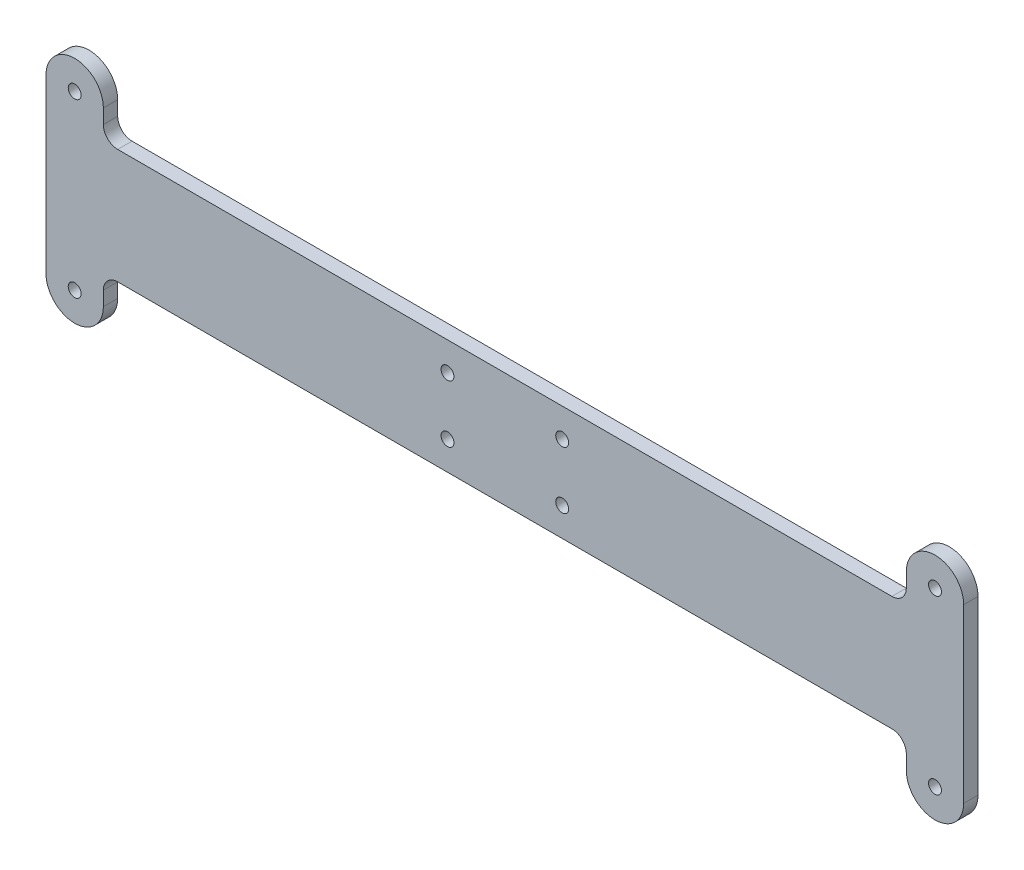
ISO-10303-21;
HEADER;
FILE_DESCRIPTION(('STEP AP214'),'2;1');
FILE_NAME('part.step','',(''),(''),'','','');
FILE_SCHEMA(('AUTOMOTIVE_DESIGN { 1 0 10303 214 1 1 1 1 }'));
ENDSEC;
DATA;
#1=APPLICATION_CONTEXT('core data for automotive mechanical design processes');
#2=APPLICATION_PROTOCOL_DEFINITION('international standard','automotive_design',2000,#1);
#3=PRODUCT_CONTEXT('',#1,'mechanical');
#4=PRODUCT('Part','Part','',(#3));
#5=PRODUCT_RELATED_PRODUCT_CATEGORY('part','',(#4));
#6=PRODUCT_DEFINITION_FORMATION('','',#4);
#7=PRODUCT_DEFINITION_CONTEXT('part definition',#1,'design');
#8=PRODUCT_DEFINITION('design','',#6,#7);
#9=PRODUCT_DEFINITION_SHAPE('','',#8);
#10=(LENGTH_UNIT() NAMED_UNIT(*) SI_UNIT(.MILLI.,.METRE.));
#11=(NAMED_UNIT(*) PLANE_ANGLE_UNIT() SI_UNIT($,.RADIAN.));
#12=(NAMED_UNIT(*) SI_UNIT($,.STERADIAN.) SOLID_ANGLE_UNIT());
#13=UNCERTAINTY_MEASURE_WITH_UNIT(LENGTH_MEASURE(1.E-05),#10,'distance_accuracy_value','');
#14=(GEOMETRIC_REPRESENTATION_CONTEXT(3) GLOBAL_UNCERTAINTY_ASSIGNED_CONTEXT((#13)) GLOBAL_UNIT_ASSIGNED_CONTEXT((#10,
#11,#12)) REPRESENTATION_CONTEXT('',''));
#15=CARTESIAN_POINT('',(0.,0.,0.));
#16=DIRECTION('',(0.,0.,1.));
#17=DIRECTION('',(1.,0.,0.));
#18=AXIS2_PLACEMENT_3D('',#15,#16,#17);
#19=CARTESIAN_POINT('',(150.,-10.,5.));
#20=DIRECTION('',(0.,0.,1.));
#21=DIRECTION('',(1.,0.,0.));
#22=AXIS2_PLACEMENT_3D('',#19,#20,#21);
#23=PLANE('',#22);
#24=CARTESIAN_POINT('',(-20.,10.,5.));
#25=DIRECTION('',(0.,0.,-1.));
#26=DIRECTION('',(-1.,0.,0.));
#27=AXIS2_PLACEMENT_3D('',#24,#25,#26);
#28=CIRCLE('',#27,2.25);
#29=CARTESIAN_POINT('',(-22.25,10.,5.));
#30=VERTEX_POINT('',#29);
#31=EDGE_CURVE('E351',#30,#30,#28,.T.);
#32=ORIENTED_EDGE('',*,*,#31,.T.);
#33=EDGE_LOOP('',(#32));
#34=FACE_BOUND('',#33,.T.);
#35=CARTESIAN_POINT('',(20.,10.,5.));
#36=DIRECTION('',(0.,0.,-1.));
#37=DIRECTION('',(-1.,0.,0.));
#38=AXIS2_PLACEMENT_3D('',#35,#36,#37);
#39=CIRCLE('',#38,2.25);
#40=CARTESIAN_POINT('',(17.75,10.,5.));
#41=VERTEX_POINT('',#40);
#42=EDGE_CURVE('E361',#41,#41,#39,.T.);
#43=ORIENTED_EDGE('',*,*,#42,.T.);
#44=EDGE_LOOP('',(#43));
#45=FACE_BOUND('',#44,.T.);
#46=CARTESIAN_POINT('',(20.,30.,5.));
#47=DIRECTION('',(0.,0.,-1.));
#48=DIRECTION('',(-1.,0.,0.));
#49=AXIS2_PLACEMENT_3D('',#46,#47,#48);
#50=CIRCLE('',#49,2.25);
#51=CARTESIAN_POINT('',(17.75,30.,5.));
#52=VERTEX_POINT('',#51);
#53=EDGE_CURVE('E367',#52,#52,#50,.T.);
#54=ORIENTED_EDGE('',*,*,#53,.T.);
#55=EDGE_LOOP('',(#54));
#56=FACE_BOUND('',#55,.T.);
#57=CARTESIAN_POINT('',(-20.,30.,5.));
#58=DIRECTION('',(0.,0.,-1.));
#59=DIRECTION('',(-1.,0.,0.));
#60=AXIS2_PLACEMENT_3D('',#57,#58,#59);
#61=CIRCLE('',#60,2.25);
#62=CARTESIAN_POINT('',(-22.25,30.,5.));
#63=VERTEX_POINT('',#62);
#64=EDGE_CURVE('E373',#63,#63,#61,.T.);
#65=ORIENTED_EDGE('',*,*,#64,.T.);
#66=EDGE_LOOP('',(#65));
#67=FACE_BOUND('',#66,.T.);
#68=CARTESIAN_POINT('',(-150.,-10.,5.));
#69=DIRECTION('',(0.,0.,-1.));
#70=DIRECTION('',(-1.,0.,0.));
#71=AXIS2_PLACEMENT_3D('',#68,#69,#70);
#72=CIRCLE('',#71,2.25);
#73=CARTESIAN_POINT('',(-152.25,-10.,5.));
#74=VERTEX_POINT('',#73);
#75=EDGE_CURVE('E391',#74,#74,#72,.T.);
#76=ORIENTED_EDGE('',*,*,#75,.T.);
#77=EDGE_LOOP('',(#76));
#78=FACE_BOUND('',#77,.T.);
#79=CARTESIAN_POINT('',(150.,-10.,5.));
#80=DIRECTION('',(0.,0.,1.));
#81=DIRECTION('',(1.,0.,0.));
#82=AXIS2_PLACEMENT_3D('',#79,#80,#81);
#83=CIRCLE('',#82,9.99999999999999);
#84=CARTESIAN_POINT('',(140.,-10.,5.));
#85=VERTEX_POINT('',#84);
#86=CARTESIAN_POINT('',(160.,-10.,5.));
#87=VERTEX_POINT('',#86);
#88=EDGE_CURVE('E209',#85,#87,#83,.T.);
#89=ORIENTED_EDGE('',*,*,#88,.T.);
#90=DIRECTION('',(0.,1.,0.));
#91=VECTOR('',#90,1.);
#92=CARTESIAN_POINT('',(160.,-10.,5.));
#93=LINE('',#92,#91);
#94=CARTESIAN_POINT('',(160.,50.,5.));
#95=VERTEX_POINT('',#94);
#96=EDGE_CURVE('E117',#87,#95,#93,.T.);
#97=ORIENTED_EDGE('',*,*,#96,.T.);
#98=CARTESIAN_POINT('',(150.,50.,5.));
#99=DIRECTION('',(0.,0.,1.));
#100=DIRECTION('',(-1.,0.,0.));
#101=AXIS2_PLACEMENT_3D('',#98,#99,#100);
#102=CIRCLE('',#101,9.99999999999998);
#103=CARTESIAN_POINT('',(140.,50.,5.));
#104=VERTEX_POINT('',#103);
#105=EDGE_CURVE('E248',#95,#104,#102,.T.);
#106=ORIENTED_EDGE('',*,*,#105,.T.);
#107=DIRECTION('',(0.,-1.,0.));
#108=VECTOR('',#107,1.);
#109=CARTESIAN_POINT('',(140.,45.,5.));
#110=LINE('',#109,#108);
#111=CARTESIAN_POINT('',(140.,45.,5.));
#112=VERTEX_POINT('',#111);
#113=EDGE_CURVE('E267',#104,#112,#110,.T.);
#114=ORIENTED_EDGE('',*,*,#113,.T.);
#115=CARTESIAN_POINT('',(135.,45.,5.));
#116=DIRECTION('',(0.,0.,-1.));
#117=DIRECTION('',(1.,0.,0.));
#118=AXIS2_PLACEMENT_3D('',#115,#116,#117);
#119=CIRCLE('',#118,5.);
#120=CARTESIAN_POINT('',(135.,40.,5.));
#121=VERTEX_POINT('',#120);
#122=EDGE_CURVE('E264',#112,#121,#119,.T.);
#123=ORIENTED_EDGE('',*,*,#122,.T.);
#124=DIRECTION('',(-1.,0.,0.));
#125=VECTOR('',#124,1.);
#126=CARTESIAN_POINT('',(-135.,40.,5.));
#127=LINE('',#126,#125);
#128=CARTESIAN_POINT('',(-135.,40.,5.));
#129=VERTEX_POINT('',#128);
#130=EDGE_CURVE('E266',#121,#129,#127,.T.);
#131=ORIENTED_EDGE('',*,*,#130,.T.);
#132=CARTESIAN_POINT('',(-135.,45.,5.));
#133=DIRECTION('',(0.,0.,-1.));
#134=DIRECTION('',(-1.,0.,0.));
#135=AXIS2_PLACEMENT_3D('',#132,#133,#134);
#136=CIRCLE('',#135,5.);
#137=CARTESIAN_POINT('',(-140.,45.,5.));
#138=VERTEX_POINT('',#137);
#139=EDGE_CURVE('E269',#129,#138,#136,.T.);
#140=ORIENTED_EDGE('',*,*,#139,.T.);
#141=DIRECTION('',(0.,1.,0.));
#142=VECTOR('',#141,1.);
#143=CARTESIAN_POINT('',(-140.,45.,5.));
#144=LINE('',#143,#142);
#145=CARTESIAN_POINT('',(-140.,50.,5.));
#146=VERTEX_POINT('',#145);
#147=EDGE_CURVE('E275',#138,#146,#144,.T.);
#148=ORIENTED_EDGE('',*,*,#147,.T.);
#149=CARTESIAN_POINT('',(-150.,50.,5.));
#150=DIRECTION('',(0.,0.,1.));
#151=DIRECTION('',(1.,0.,0.));
#152=AXIS2_PLACEMENT_3D('',#149,#150,#151);
#153=CIRCLE('',#152,9.99999999999999);
#154=CARTESIAN_POINT('',(-160.,50.,5.));
#155=VERTEX_POINT('',#154);
#156=EDGE_CURVE('E277',#146,#155,#153,.T.);
#157=ORIENTED_EDGE('',*,*,#156,.T.);
#158=DIRECTION('',(0.,-1.,0.));
#159=VECTOR('',#158,1.);
#160=CARTESIAN_POINT('',(-160.,-10.,5.));
#161=LINE('',#160,#159);
#162=CARTESIAN_POINT('',(-160.,-10.,5.));
#163=VERTEX_POINT('',#162);
#164=EDGE_CURVE('E279',#155,#163,#161,.T.);
#165=ORIENTED_EDGE('',*,*,#164,.T.);
#166=CARTESIAN_POINT('',(-150.,-10.,5.));
#167=DIRECTION('',(0.,0.,1.));
#168=DIRECTION('',(-1.,0.,0.));
#169=AXIS2_PLACEMENT_3D('',#166,#167,#168);
#170=CIRCLE('',#169,9.99999999999999);
#171=CARTESIAN_POINT('',(-140.,-10.,5.));
#172=VERTEX_POINT('',#171);
#173=EDGE_CURVE('E281',#163,#172,#170,.T.);
#174=ORIENTED_EDGE('',*,*,#173,.T.);
#175=DIRECTION('',(0.,1.,0.));
#176=VECTOR('',#175,1.);
#177=CARTESIAN_POINT('',(-140.,-5.00000000000004,5.));
#178=LINE('',#177,#176);
#179=CARTESIAN_POINT('',(-140.,-5.00000000000003,5.));
#180=VERTEX_POINT('',#179);
#181=EDGE_CURVE('E283',#172,#180,#178,.T.);
#182=ORIENTED_EDGE('',*,*,#181,.T.);
#183=CARTESIAN_POINT('',(-135.,-5.,5.));
#184=DIRECTION('',(0.,0.,-1.));
#185=DIRECTION('',(1.,0.,0.));
#186=AXIS2_PLACEMENT_3D('',#183,#184,#185);
#187=CIRCLE('',#186,5.);
#188=CARTESIAN_POINT('',(-135.,0.,5.));
#189=VERTEX_POINT('',#188);
#190=EDGE_CURVE('E160',#180,#189,#187,.T.);
#191=ORIENTED_EDGE('',*,*,#190,.T.);
#192=DIRECTION('',(1.,0.,0.));
#193=VECTOR('',#192,1.);
#194=CARTESIAN_POINT('',(-135.,0.,5.));
#195=LINE('',#194,#193);
#196=CARTESIAN_POINT('',(135.,0.,5.));
#197=VERTEX_POINT('',#196);
#198=EDGE_CURVE('E154',#189,#197,#195,.T.);
#199=ORIENTED_EDGE('',*,*,#198,.T.);
#200=CARTESIAN_POINT('',(135.,-5.,5.));
#201=DIRECTION('',(0.,0.,-1.));
#202=DIRECTION('',(-1.,0.,0.));
#203=AXIS2_PLACEMENT_3D('',#200,#201,#202);
#204=CIRCLE('',#203,5.);
#205=CARTESIAN_POINT('',(140.,-5.00000000000004,5.));
#206=VERTEX_POINT('',#205);
#207=EDGE_CURVE('E158',#197,#206,#204,.T.);
#208=ORIENTED_EDGE('',*,*,#207,.T.);
#209=DIRECTION('',(0.,-1.,0.));
#210=VECTOR('',#209,1.);
#211=CARTESIAN_POINT('',(140.,-5.00000000000004,5.));
#212=LINE('',#211,#210);
#213=EDGE_CURVE('E50',#206,#85,#212,.T.);
#214=ORIENTED_EDGE('',*,*,#213,.T.);
#215=EDGE_LOOP('',(#89,#97,#106,#114,#123,#131,#140,#148,#157,#165,#174,#182,#191,#199,#208,#214));
#216=FACE_BOUND('',#215,.T.);
#217=CARTESIAN_POINT('',(150.,50.,5.));
#218=DIRECTION('',(0.,0.,-1.));
#219=DIRECTION('',(-1.,0.,0.));
#220=AXIS2_PLACEMENT_3D('',#217,#218,#219);
#221=CIRCLE('',#220,2.25);
#222=CARTESIAN_POINT('',(147.75,50.,5.));
#223=VERTEX_POINT('',#222);
#224=EDGE_CURVE('E182',#223,#223,#221,.T.);
#225=ORIENTED_EDGE('',*,*,#224,.T.);
#226=EDGE_LOOP('',(#225));
#227=FACE_BOUND('',#226,.T.);
#228=CARTESIAN_POINT('',(-150.,50.,5.));
#229=DIRECTION('',(0.,0.,-1.));
#230=DIRECTION('',(-1.,0.,0.));
#231=AXIS2_PLACEMENT_3D('',#228,#229,#230);
#232=CIRCLE('',#231,2.25);
#233=CARTESIAN_POINT('',(-152.25,50.,5.));
#234=VERTEX_POINT('',#233);
#235=EDGE_CURVE('E385',#234,#234,#232,.T.);
#236=ORIENTED_EDGE('',*,*,#235,.T.);
#237=EDGE_LOOP('',(#236));
#238=FACE_BOUND('',#237,.T.);
#239=CARTESIAN_POINT('',(150.,-10.,5.));
#240=DIRECTION('',(0.,0.,-1.));
#241=DIRECTION('',(-1.,0.,0.));
#242=AXIS2_PLACEMENT_3D('',#239,#240,#241);
#243=CIRCLE('',#242,2.25);
#244=CARTESIAN_POINT('',(147.75,-10.,5.));
#245=VERTEX_POINT('',#244);
#246=EDGE_CURVE('E379',#245,#245,#243,.T.);
#247=ORIENTED_EDGE('',*,*,#246,.T.);
#248=EDGE_LOOP('',(#247));
#249=FACE_BOUND('',#248,.T.);
#250=ADVANCED_FACE('F33',(#34,#45,#56,#67,#78,#216,#227,#238,#249),#23,.T.);
#251=CARTESIAN_POINT('',(150.,-10.,0.));
#252=DIRECTION('',(0.,0.,1.));
#253=DIRECTION('',(1.,0.,0.));
#254=AXIS2_PLACEMENT_3D('',#251,#252,#253);
#255=PLANE('',#254);
#256=CARTESIAN_POINT('',(-20.,10.,0.));
#257=DIRECTION('',(0.,0.,-1.));
#258=DIRECTION('',(-1.,0.,0.));
#259=AXIS2_PLACEMENT_3D('',#256,#257,#258);
#260=CIRCLE('',#259,2.24999999999999);
#261=CARTESIAN_POINT('',(-22.25,10.,0.));
#262=VERTEX_POINT('',#261);
#263=EDGE_CURVE('E354',#262,#262,#260,.T.);
#264=ORIENTED_EDGE('',*,*,#263,.F.);
#265=EDGE_LOOP('',(#264));
#266=FACE_BOUND('',#265,.T.);
#267=CARTESIAN_POINT('',(20.,10.,0.));
#268=DIRECTION('',(0.,0.,-1.));
#269=DIRECTION('',(-1.,0.,0.));
#270=AXIS2_PLACEMENT_3D('',#267,#268,#269);
#271=CIRCLE('',#270,2.24999999999999);
#272=CARTESIAN_POINT('',(17.75,10.,0.));
#273=VERTEX_POINT('',#272);
#274=EDGE_CURVE('E356',#273,#273,#271,.T.);
#275=ORIENTED_EDGE('',*,*,#274,.F.);
#276=EDGE_LOOP('',(#275));
#277=FACE_BOUND('',#276,.T.);
#278=CARTESIAN_POINT('',(20.,30.,0.));
#279=DIRECTION('',(0.,0.,-1.));
#280=DIRECTION('',(-1.,0.,0.));
#281=AXIS2_PLACEMENT_3D('',#278,#279,#280);
#282=CIRCLE('',#281,2.24999999999999);
#283=CARTESIAN_POINT('',(17.75,30.,0.));
#284=VERTEX_POINT('',#283);
#285=EDGE_CURVE('E364',#284,#284,#282,.T.);
#286=ORIENTED_EDGE('',*,*,#285,.F.);
#287=EDGE_LOOP('',(#286));
#288=FACE_BOUND('',#287,.T.);
#289=CARTESIAN_POINT('',(-20.,30.,0.));
#290=DIRECTION('',(0.,0.,-1.));
#291=DIRECTION('',(-1.,0.,0.));
#292=AXIS2_PLACEMENT_3D('',#289,#290,#291);
#293=CIRCLE('',#292,2.24999999999999);
#294=CARTESIAN_POINT('',(-22.25,30.,0.));
#295=VERTEX_POINT('',#294);
#296=EDGE_CURVE('E370',#295,#295,#293,.T.);
#297=ORIENTED_EDGE('',*,*,#296,.F.);
#298=EDGE_LOOP('',(#297));
#299=FACE_BOUND('',#298,.T.);
#300=CARTESIAN_POINT('',(150.,-10.,0.));
#301=DIRECTION('',(0.,0.,-1.));
#302=DIRECTION('',(-1.,0.,0.));
#303=AXIS2_PLACEMENT_3D('',#300,#301,#302);
#304=CIRCLE('',#303,2.24999999999997);
#305=CARTESIAN_POINT('',(147.75,-10.,0.));
#306=VERTEX_POINT('',#305);
#307=EDGE_CURVE('E376',#306,#306,#304,.T.);
#308=ORIENTED_EDGE('',*,*,#307,.F.);
#309=EDGE_LOOP('',(#308));
#310=FACE_BOUND('',#309,.T.);
#311=CARTESIAN_POINT('',(-150.,50.,0.));
#312=DIRECTION('',(0.,0.,-1.));
#313=DIRECTION('',(-1.,0.,0.));
#314=AXIS2_PLACEMENT_3D('',#311,#312,#313);
#315=CIRCLE('',#314,2.24999999999997);
#316=CARTESIAN_POINT('',(-152.25,50.,0.));
#317=VERTEX_POINT('',#316);
#318=EDGE_CURVE('E382',#317,#317,#315,.T.);
#319=ORIENTED_EDGE('',*,*,#318,.F.);
#320=EDGE_LOOP('',(#319));
#321=FACE_BOUND('',#320,.T.);
#322=CARTESIAN_POINT('',(150.,50.,0.));
#323=DIRECTION('',(0.,0.,-1.));
#324=DIRECTION('',(-1.,0.,0.));
#325=AXIS2_PLACEMENT_3D('',#322,#323,#324);
#326=CIRCLE('',#325,2.24999999999997);
#327=CARTESIAN_POINT('',(147.75,50.,0.));
#328=VERTEX_POINT('',#327);
#329=EDGE_CURVE('E394',#328,#328,#326,.T.);
#330=ORIENTED_EDGE('',*,*,#329,.F.);
#331=EDGE_LOOP('',(#330));
#332=FACE_BOUND('',#331,.T.);
#333=CARTESIAN_POINT('',(150.,-10.,0.));
#334=DIRECTION('',(0.,0.,1.));
#335=DIRECTION('',(1.,0.,0.));
#336=AXIS2_PLACEMENT_3D('',#333,#334,#335);
#337=CIRCLE('',#336,9.99999999999999);
#338=CARTESIAN_POINT('',(140.,-10.,0.));
#339=VERTEX_POINT('',#338);
#340=CARTESIAN_POINT('',(160.,-10.,0.));
#341=VERTEX_POINT('',#340);
#342=EDGE_CURVE('E178',#339,#341,#337,.T.);
#343=ORIENTED_EDGE('',*,*,#342,.F.);
#344=DIRECTION('',(0.,-1.,0.));
#345=VECTOR('',#344,1.);
#346=CARTESIAN_POINT('',(140.,-5.00000000000004,0.));
#347=LINE('',#346,#345);
#348=CARTESIAN_POINT('',(140.,-5.00000000000004,0.));
#349=VERTEX_POINT('',#348);
#350=EDGE_CURVE('E109',#349,#339,#347,.T.);
#351=ORIENTED_EDGE('',*,*,#350,.F.);
#352=CARTESIAN_POINT('',(135.,-5.,0.));
#353=DIRECTION('',(0.,0.,-1.));
#354=DIRECTION('',(-1.,0.,0.));
#355=AXIS2_PLACEMENT_3D('',#352,#353,#354);
#356=CIRCLE('',#355,5.);
#357=CARTESIAN_POINT('',(135.,0.,0.));
#358=VERTEX_POINT('',#357);
#359=EDGE_CURVE('E103',#358,#349,#356,.T.);
#360=ORIENTED_EDGE('',*,*,#359,.F.);
#361=DIRECTION('',(1.,0.,0.));
#362=VECTOR('',#361,1.);
#363=CARTESIAN_POINT('',(-135.,0.,0.));
#364=LINE('',#363,#362);
#365=CARTESIAN_POINT('',(-135.,0.,0.));
#366=VERTEX_POINT('',#365);
#367=EDGE_CURVE('E168',#366,#358,#364,.T.);
#368=ORIENTED_EDGE('',*,*,#367,.F.);
#369=CARTESIAN_POINT('',(-135.,-5.,0.));
#370=DIRECTION('',(0.,0.,-1.));
#371=DIRECTION('',(1.,0.,0.));
#372=AXIS2_PLACEMENT_3D('',#369,#370,#371);
#373=CIRCLE('',#372,5.);
#374=CARTESIAN_POINT('',(-140.,-5.00000000000003,0.));
#375=VERTEX_POINT('',#374);
#376=EDGE_CURVE('E204',#375,#366,#373,.T.);
#377=ORIENTED_EDGE('',*,*,#376,.F.);
#378=DIRECTION('',(0.,1.,0.));
#379=VECTOR('',#378,1.);
#380=CARTESIAN_POINT('',(-140.,-5.00000000000004,0.));
#381=LINE('',#380,#379);
#382=CARTESIAN_POINT('',(-140.,-10.,0.));
#383=VERTEX_POINT('',#382);
#384=EDGE_CURVE('E202',#383,#375,#381,.T.);
#385=ORIENTED_EDGE('',*,*,#384,.F.);
#386=CARTESIAN_POINT('',(-150.,-10.,0.));
#387=DIRECTION('',(0.,0.,1.));
#388=DIRECTION('',(-1.,0.,0.));
#389=AXIS2_PLACEMENT_3D('',#386,#387,#388);
#390=CIRCLE('',#389,9.99999999999999);
#391=CARTESIAN_POINT('',(-160.,-10.,0.));
#392=VERTEX_POINT('',#391);
#393=EDGE_CURVE('E200',#392,#383,#390,.T.);
#394=ORIENTED_EDGE('',*,*,#393,.F.);
#395=DIRECTION('',(0.,-1.,0.));
#396=VECTOR('',#395,1.);
#397=CARTESIAN_POINT('',(-160.,-10.,0.));
#398=LINE('',#397,#396);
#399=CARTESIAN_POINT('',(-160.,50.,0.));
#400=VERTEX_POINT('',#399);
#401=EDGE_CURVE('E198',#400,#392,#398,.T.);
#402=ORIENTED_EDGE('',*,*,#401,.F.);
#403=CARTESIAN_POINT('',(-150.,50.,0.));
#404=DIRECTION('',(0.,0.,1.));
#405=DIRECTION('',(1.,0.,0.));
#406=AXIS2_PLACEMENT_3D('',#403,#404,#405);
#407=CIRCLE('',#406,9.99999999999999);
#408=CARTESIAN_POINT('',(-140.,50.,0.));
#409=VERTEX_POINT('',#408);
#410=EDGE_CURVE('E196',#409,#400,#407,.T.);
#411=ORIENTED_EDGE('',*,*,#410,.F.);
#412=DIRECTION('',(0.,1.,0.));
#413=VECTOR('',#412,1.);
#414=CARTESIAN_POINT('',(-140.,45.,0.));
#415=LINE('',#414,#413);
#416=CARTESIAN_POINT('',(-140.,45.,0.));
#417=VERTEX_POINT('',#416);
#418=EDGE_CURVE('E194',#417,#409,#415,.T.);
#419=ORIENTED_EDGE('',*,*,#418,.F.);
#420=CARTESIAN_POINT('',(-135.,45.,0.));
#421=DIRECTION('',(0.,0.,-1.));
#422=DIRECTION('',(-1.,0.,0.));
#423=AXIS2_PLACEMENT_3D('',#420,#421,#422);
#424=CIRCLE('',#423,5.);
#425=CARTESIAN_POINT('',(-135.,40.,0.));
#426=VERTEX_POINT('',#425);
#427=EDGE_CURVE('E192',#426,#417,#424,.T.);
#428=ORIENTED_EDGE('',*,*,#427,.F.);
#429=DIRECTION('',(-1.,0.,0.));
#430=VECTOR('',#429,1.);
#431=CARTESIAN_POINT('',(-135.,40.,0.));
#432=LINE('',#431,#430);
#433=CARTESIAN_POINT('',(135.,40.,0.));
#434=VERTEX_POINT('',#433);
#435=EDGE_CURVE('E190',#434,#426,#432,.T.);
#436=ORIENTED_EDGE('',*,*,#435,.F.);
#437=CARTESIAN_POINT('',(135.,45.,0.));
#438=DIRECTION('',(0.,0.,-1.));
#439=DIRECTION('',(1.,0.,0.));
#440=AXIS2_PLACEMENT_3D('',#437,#438,#439);
#441=CIRCLE('',#440,5.);
#442=CARTESIAN_POINT('',(140.,45.,0.));
#443=VERTEX_POINT('',#442);
#444=EDGE_CURVE('E188',#443,#434,#441,.T.);
#445=ORIENTED_EDGE('',*,*,#444,.F.);
#446=DIRECTION('',(0.,-1.,0.));
#447=VECTOR('',#446,1.);
#448=CARTESIAN_POINT('',(140.,45.,0.));
#449=LINE('',#448,#447);
#450=CARTESIAN_POINT('',(140.,50.,0.));
#451=VERTEX_POINT('',#450);
#452=EDGE_CURVE('E186',#451,#443,#449,.T.);
#453=ORIENTED_EDGE('',*,*,#452,.F.);
#454=CARTESIAN_POINT('',(150.,50.,0.));
#455=DIRECTION('',(0.,0.,1.));
#456=DIRECTION('',(-1.,0.,0.));
#457=AXIS2_PLACEMENT_3D('',#454,#455,#456);
#458=CIRCLE('',#457,9.99999999999998);
#459=CARTESIAN_POINT('',(160.,50.,0.));
#460=VERTEX_POINT('',#459);
#461=EDGE_CURVE('E184',#460,#451,#458,.T.);
#462=ORIENTED_EDGE('',*,*,#461,.F.);
#463=DIRECTION('',(0.,1.,0.));
#464=VECTOR('',#463,1.);
#465=CARTESIAN_POINT('',(160.,-10.,0.));
#466=LINE('',#465,#464);
#467=EDGE_CURVE('E181',#341,#460,#466,.T.);
#468=ORIENTED_EDGE('',*,*,#467,.F.);
#469=EDGE_LOOP('',(#343,#351,#360,#368,#377,#385,#394,#402,#411,#419,#428,#436,#445,#453,#462,#468));
#470=FACE_BOUND('',#469,.T.);
#471=CARTESIAN_POINT('',(-150.,-10.,0.));
#472=DIRECTION('',(0.,0.,-1.));
#473=DIRECTION('',(-1.,0.,0.));
#474=AXIS2_PLACEMENT_3D('',#471,#472,#473);
#475=CIRCLE('',#474,2.24999999999997);
#476=CARTESIAN_POINT('',(-152.25,-10.,0.));
#477=VERTEX_POINT('',#476);
#478=EDGE_CURVE('E388',#477,#477,#475,.T.);
#479=ORIENTED_EDGE('',*,*,#478,.F.);
#480=EDGE_LOOP('',(#479));
#481=FACE_BOUND('',#480,.T.);
#482=ADVANCED_FACE('F252',(#266,#277,#288,#299,#310,#321,#332,#470,#481),#255,.F.);
#483=CARTESIAN_POINT('',(150.,-10.,5.));
#484=DIRECTION('',(0.,0.,-1.));
#485=DIRECTION('',(-1.,0.,0.));
#486=AXIS2_PLACEMENT_3D('',#483,#484,#485);
#487=CYLINDRICAL_SURFACE('',#486,9.99999999999999);
#488=ORIENTED_EDGE('',*,*,#342,.T.);
#489=DIRECTION('',(0.,0.,-1.));
#490=VECTOR('',#489,1.);
#491=CARTESIAN_POINT('',(160.,-10.,5.));
#492=LINE('',#491,#490);
#493=EDGE_CURVE('E11',#87,#341,#492,.T.);
#494=ORIENTED_EDGE('',*,*,#493,.F.);
#495=ORIENTED_EDGE('',*,*,#88,.F.);
#496=DIRECTION('',(0.,0.,-1.));
#497=VECTOR('',#496,1.);
#498=CARTESIAN_POINT('',(140.,-10.,5.));
#499=LINE('',#498,#497);
#500=EDGE_CURVE('E174',#85,#339,#499,.T.);
#501=ORIENTED_EDGE('',*,*,#500,.T.);
#502=EDGE_LOOP('',(#488,#494,#495,#501));
#503=FACE_BOUND('',#502,.T.);
#504=ADVANCED_FACE('F35',(#503),#487,.T.);
#505=CARTESIAN_POINT('',(160.,-10.,5.));
#506=DIRECTION('',(-1.,0.,0.));
#507=DIRECTION('',(0.,0.,1.));
#508=AXIS2_PLACEMENT_3D('',#505,#506,#507);
#509=PLANE('',#508);
#510=ORIENTED_EDGE('',*,*,#467,.T.);
#511=DIRECTION('',(0.,0.,-1.));
#512=VECTOR('',#511,1.);
#513=CARTESIAN_POINT('',(160.,50.,5.));
#514=LINE('',#513,#512);
#515=EDGE_CURVE('E42',#95,#460,#514,.T.);
#516=ORIENTED_EDGE('',*,*,#515,.F.);
#517=ORIENTED_EDGE('',*,*,#96,.F.);
#518=ORIENTED_EDGE('',*,*,#493,.T.);
#519=EDGE_LOOP('',(#510,#516,#517,#518));
#520=FACE_BOUND('',#519,.T.);
#521=ADVANCED_FACE('F580',(#520),#509,.F.);
#522=CARTESIAN_POINT('',(150.,50.,5.));
#523=DIRECTION('',(0.,0.,-1.));
#524=DIRECTION('',(-1.,0.,0.));
#525=AXIS2_PLACEMENT_3D('',#522,#523,#524);
#526=CYLINDRICAL_SURFACE('',#525,9.99999999999998);
#527=ORIENTED_EDGE('',*,*,#461,.T.);
#528=DIRECTION('',(0.,0.,-1.));
#529=VECTOR('',#528,1.);
#530=CARTESIAN_POINT('',(140.,50.,5.));
#531=LINE('',#530,#529);
#532=EDGE_CURVE('E240',#104,#451,#531,.T.);
#533=ORIENTED_EDGE('',*,*,#532,.F.);
#534=ORIENTED_EDGE('',*,*,#105,.F.);
#535=ORIENTED_EDGE('',*,*,#515,.T.);
#536=EDGE_LOOP('',(#527,#533,#534,#535));
#537=FACE_BOUND('',#536,.T.);
#538=ADVANCED_FACE('F246',(#537),#526,.T.);
#539=CARTESIAN_POINT('',(140.,45.,5.));
#540=DIRECTION('',(1.,0.,0.));
#541=DIRECTION('',(0.,0.,-1.));
#542=AXIS2_PLACEMENT_3D('',#539,#540,#541);
#543=PLANE('',#542);
#544=ORIENTED_EDGE('',*,*,#452,.T.);
#545=DIRECTION('',(0.,0.,-1.));
#546=VECTOR('',#545,1.);
#547=CARTESIAN_POINT('',(140.,45.,5.));
#548=LINE('',#547,#546);
#549=EDGE_CURVE('E237',#112,#443,#548,.T.);
#550=ORIENTED_EDGE('',*,*,#549,.F.);
#551=ORIENTED_EDGE('',*,*,#113,.F.);
#552=ORIENTED_EDGE('',*,*,#532,.T.);
#553=EDGE_LOOP('',(#544,#550,#551,#552));
#554=FACE_BOUND('',#553,.T.);
#555=ADVANCED_FACE('F258',(#554),#543,.F.);
#556=CARTESIAN_POINT('',(135.,45.,5.));
#557=DIRECTION('',(0.,0.,-1.));
#558=DIRECTION('',(-1.,0.,0.));
#559=AXIS2_PLACEMENT_3D('',#556,#557,#558);
#560=CYLINDRICAL_SURFACE('',#559,5.);
#561=ORIENTED_EDGE('',*,*,#444,.T.);
#562=DIRECTION('',(0.,0.,-1.));
#563=VECTOR('',#562,1.);
#564=CARTESIAN_POINT('',(135.,40.,5.));
#565=LINE('',#564,#563);
#566=EDGE_CURVE('E234',#121,#434,#565,.T.);
#567=ORIENTED_EDGE('',*,*,#566,.F.);
#568=ORIENTED_EDGE('',*,*,#122,.F.);
#569=ORIENTED_EDGE('',*,*,#549,.T.);
#570=EDGE_LOOP('',(#561,#567,#568,#569));
#571=FACE_BOUND('',#570,.T.);
#572=ADVANCED_FACE('F262',(#571),#560,.F.);
#573=CARTESIAN_POINT('',(-135.,40.,5.));
#574=DIRECTION('',(0.,-1.,0.));
#575=DIRECTION('',(1.,0.,0.));
#576=AXIS2_PLACEMENT_3D('',#573,#574,#575);
#577=PLANE('',#576);
#578=ORIENTED_EDGE('',*,*,#435,.T.);
#579=DIRECTION('',(0.,0.,-1.));
#580=VECTOR('',#579,1.);
#581=CARTESIAN_POINT('',(-135.,40.,5.));
#582=LINE('',#581,#580);
#583=EDGE_CURVE('E231',#129,#426,#582,.T.);
#584=ORIENTED_EDGE('',*,*,#583,.F.);
#585=ORIENTED_EDGE('',*,*,#130,.F.);
#586=ORIENTED_EDGE('',*,*,#566,.T.);
#587=EDGE_LOOP('',(#578,#584,#585,#586));
#588=FACE_BOUND('',#587,.T.);
#589=ADVANCED_FACE('F545',(#588),#577,.F.);
#590=CARTESIAN_POINT('',(-135.,45.,5.));
#591=DIRECTION('',(0.,0.,-1.));
#592=DIRECTION('',(-1.,0.,0.));
#593=AXIS2_PLACEMENT_3D('',#590,#591,#592);
#594=CYLINDRICAL_SURFACE('',#593,5.);
#595=ORIENTED_EDGE('',*,*,#427,.T.);
#596=DIRECTION('',(0.,0.,-1.));
#597=VECTOR('',#596,1.);
#598=CARTESIAN_POINT('',(-140.,45.,5.));
#599=LINE('',#598,#597);
#600=EDGE_CURVE('E228',#138,#417,#599,.T.);
#601=ORIENTED_EDGE('',*,*,#600,.F.);
#602=ORIENTED_EDGE('',*,*,#139,.F.);
#603=ORIENTED_EDGE('',*,*,#583,.T.);
#604=EDGE_LOOP('',(#595,#601,#602,#603));
#605=FACE_BOUND('',#604,.T.);
#606=ADVANCED_FACE('F535',(#605),#594,.F.);
#607=CARTESIAN_POINT('',(-140.,45.,5.));
#608=DIRECTION('',(-1.,0.,0.));
#609=DIRECTION('',(0.,0.,1.));
#610=AXIS2_PLACEMENT_3D('',#607,#608,#609);
#611=PLANE('',#610);
#612=ORIENTED_EDGE('',*,*,#418,.T.);
#613=DIRECTION('',(0.,0.,-1.));
#614=VECTOR('',#613,1.);
#615=CARTESIAN_POINT('',(-140.,50.,5.));
#616=LINE('',#615,#614);
#617=EDGE_CURVE('E225',#146,#409,#616,.T.);
#618=ORIENTED_EDGE('',*,*,#617,.F.);
#619=ORIENTED_EDGE('',*,*,#147,.F.);
#620=ORIENTED_EDGE('',*,*,#600,.T.);
#621=EDGE_LOOP('',(#612,#618,#619,#620));
#622=FACE_BOUND('',#621,.T.);
#623=ADVANCED_FACE('F525',(#622),#611,.F.);
#624=CARTESIAN_POINT('',(-150.,50.,5.));
#625=DIRECTION('',(0.,0.,-1.));
#626=DIRECTION('',(-1.,0.,0.));
#627=AXIS2_PLACEMENT_3D('',#624,#625,#626);
#628=CYLINDRICAL_SURFACE('',#627,9.99999999999999);
#629=ORIENTED_EDGE('',*,*,#410,.T.);
#630=DIRECTION('',(0.,0.,-1.));
#631=VECTOR('',#630,1.);
#632=CARTESIAN_POINT('',(-160.,50.,5.));
#633=LINE('',#632,#631);
#634=EDGE_CURVE('E222',#155,#400,#633,.T.);
#635=ORIENTED_EDGE('',*,*,#634,.F.);
#636=ORIENTED_EDGE('',*,*,#156,.F.);
#637=ORIENTED_EDGE('',*,*,#617,.T.);
#638=EDGE_LOOP('',(#629,#635,#636,#637));
#639=FACE_BOUND('',#638,.T.);
#640=ADVANCED_FACE('F515',(#639),#628,.T.);
#641=CARTESIAN_POINT('',(-160.,-10.,5.));
#642=DIRECTION('',(1.,0.,0.));
#643=DIRECTION('',(0.,1.,0.));
#644=AXIS2_PLACEMENT_3D('',#641,#642,#643);
#645=PLANE('',#644);
#646=ORIENTED_EDGE('',*,*,#401,.T.);
#647=DIRECTION('',(0.,0.,-1.));
#648=VECTOR('',#647,1.);
#649=CARTESIAN_POINT('',(-160.,-10.,5.));
#650=LINE('',#649,#648);
#651=EDGE_CURVE('E219',#163,#392,#650,.T.);
#652=ORIENTED_EDGE('',*,*,#651,.F.);
#653=ORIENTED_EDGE('',*,*,#164,.F.);
#654=ORIENTED_EDGE('',*,*,#634,.T.);
#655=EDGE_LOOP('',(#646,#652,#653,#654));
#656=FACE_BOUND('',#655,.T.);
#657=ADVANCED_FACE('F505',(#656),#645,.F.);
#658=CARTESIAN_POINT('',(-150.,-10.,5.));
#659=DIRECTION('',(0.,0.,-1.));
#660=DIRECTION('',(-1.,0.,0.));
#661=AXIS2_PLACEMENT_3D('',#658,#659,#660);
#662=CYLINDRICAL_SURFACE('',#661,9.99999999999999);
#663=ORIENTED_EDGE('',*,*,#393,.T.);
#664=DIRECTION('',(0.,0.,-1.));
#665=VECTOR('',#664,1.);
#666=CARTESIAN_POINT('',(-140.,-10.,5.));
#667=LINE('',#666,#665);
#668=EDGE_CURVE('E216',#172,#383,#667,.T.);
#669=ORIENTED_EDGE('',*,*,#668,.F.);
#670=ORIENTED_EDGE('',*,*,#173,.F.);
#671=ORIENTED_EDGE('',*,*,#651,.T.);
#672=EDGE_LOOP('',(#663,#669,#670,#671));
#673=FACE_BOUND('',#672,.T.);
#674=ADVANCED_FACE('F496',(#673),#662,.T.);
#675=CARTESIAN_POINT('',(-140.,-5.00000000000004,5.));
#676=DIRECTION('',(-1.,0.,0.));
#677=DIRECTION('',(0.,0.,1.));
#678=AXIS2_PLACEMENT_3D('',#675,#676,#677);
#679=PLANE('',#678);
#680=ORIENTED_EDGE('',*,*,#384,.T.);
#681=DIRECTION('',(0.,0.,-1.));
#682=VECTOR('',#681,1.);
#683=CARTESIAN_POINT('',(-140.,-5.00000000000003,5.));
#684=LINE('',#683,#682);
#685=EDGE_CURVE('E213',#180,#375,#684,.T.);
#686=ORIENTED_EDGE('',*,*,#685,.F.);
#687=ORIENTED_EDGE('',*,*,#181,.F.);
#688=ORIENTED_EDGE('',*,*,#668,.T.);
#689=EDGE_LOOP('',(#680,#686,#687,#688));
#690=FACE_BOUND('',#689,.T.);
#691=ADVANCED_FACE('F289',(#690),#679,.F.);
#692=CARTESIAN_POINT('',(-135.,-5.,5.));
#693=DIRECTION('',(0.,0.,-1.));
#694=DIRECTION('',(-1.,0.,0.));
#695=AXIS2_PLACEMENT_3D('',#692,#693,#694);
#696=CYLINDRICAL_SURFACE('',#695,5.);
#697=ORIENTED_EDGE('',*,*,#376,.T.);
#698=DIRECTION('',(0.,0.,-1.));
#699=VECTOR('',#698,1.);
#700=CARTESIAN_POINT('',(-135.,0.,5.));
#701=LINE('',#700,#699);
#702=EDGE_CURVE('E169',#189,#366,#701,.T.);
#703=ORIENTED_EDGE('',*,*,#702,.F.);
#704=ORIENTED_EDGE('',*,*,#190,.F.);
#705=ORIENTED_EDGE('',*,*,#685,.T.);
#706=EDGE_LOOP('',(#697,#703,#704,#705));
#707=FACE_BOUND('',#706,.T.);
#708=ADVANCED_FACE('F293',(#707),#696,.F.);
#709=CARTESIAN_POINT('',(-135.,0.,5.));
#710=DIRECTION('',(0.,1.,0.));
#711=DIRECTION('',(0.,0.,1.));
#712=AXIS2_PLACEMENT_3D('',#709,#710,#711);
#713=PLANE('',#712);
#714=ORIENTED_EDGE('',*,*,#367,.T.);
#715=DIRECTION('',(0.,0.,-1.));
#716=VECTOR('',#715,1.);
#717=CARTESIAN_POINT('',(135.,0.,5.));
#718=LINE('',#717,#716);
#719=EDGE_CURVE('E165',#197,#358,#718,.T.);
#720=ORIENTED_EDGE('',*,*,#719,.F.);
#721=ORIENTED_EDGE('',*,*,#198,.F.);
#722=ORIENTED_EDGE('',*,*,#702,.T.);
#723=EDGE_LOOP('',(#714,#720,#721,#722));
#724=FACE_BOUND('',#723,.T.);
#725=ADVANCED_FACE('F166',(#724),#713,.F.);
#726=CARTESIAN_POINT('',(135.,-5.,5.));
#727=DIRECTION('',(0.,0.,-1.));
#728=DIRECTION('',(-1.,0.,0.));
#729=AXIS2_PLACEMENT_3D('',#726,#727,#728);
#730=CYLINDRICAL_SURFACE('',#729,5.);
#731=ORIENTED_EDGE('',*,*,#359,.T.);
#732=DIRECTION('',(0.,0.,-1.));
#733=VECTOR('',#732,1.);
#734=CARTESIAN_POINT('',(140.,-5.00000000000004,5.));
#735=LINE('',#734,#733);
#736=EDGE_CURVE('E170',#206,#349,#735,.T.);
#737=ORIENTED_EDGE('',*,*,#736,.F.);
#738=ORIENTED_EDGE('',*,*,#207,.F.);
#739=ORIENTED_EDGE('',*,*,#719,.T.);
#740=EDGE_LOOP('',(#731,#737,#738,#739));
#741=FACE_BOUND('',#740,.T.);
#742=ADVANCED_FACE('F172',(#741),#730,.F.);
#743=CARTESIAN_POINT('',(140.,-5.00000000000004,5.));
#744=DIRECTION('',(1.,0.,0.));
#745=DIRECTION('',(0.,0.,-1.));
#746=AXIS2_PLACEMENT_3D('',#743,#744,#745);
#747=PLANE('',#746);
#748=ORIENTED_EDGE('',*,*,#350,.T.);
#749=ORIENTED_EDGE('',*,*,#500,.F.);
#750=ORIENTED_EDGE('',*,*,#213,.F.);
#751=ORIENTED_EDGE('',*,*,#736,.T.);
#752=EDGE_LOOP('',(#748,#749,#750,#751));
#753=FACE_BOUND('',#752,.T.);
#754=ADVANCED_FACE('F297',(#753),#747,.F.);
#755=CARTESIAN_POINT('',(150.,50.,0.));
#756=DIRECTION('',(0.,0.,-1.));
#757=DIRECTION('',(-1.,0.,0.));
#758=AXIS2_PLACEMENT_3D('',#755,#756,#757);
#759=CYLINDRICAL_SURFACE('',#758,2.24999999999999);
#760=ORIENTED_EDGE('',*,*,#224,.F.);
#761=EDGE_LOOP('',(#760));
#762=FACE_BOUND('',#761,.T.);
#763=ORIENTED_EDGE('',*,*,#329,.T.);
#764=EDGE_LOOP('',(#763));
#765=FACE_BOUND('',#764,.T.);
#766=ADVANCED_FACE('F299',(#762,#765),#759,.F.);
#767=CARTESIAN_POINT('',(-150.,-10.,0.));
#768=DIRECTION('',(0.,0.,-1.));
#769=DIRECTION('',(-1.,0.,0.));
#770=AXIS2_PLACEMENT_3D('',#767,#768,#769);
#771=CYLINDRICAL_SURFACE('',#770,2.24999999999999);
#772=ORIENTED_EDGE('',*,*,#75,.F.);
#773=EDGE_LOOP('',(#772));
#774=FACE_BOUND('',#773,.T.);
#775=ORIENTED_EDGE('',*,*,#478,.T.);
#776=EDGE_LOOP('',(#775));
#777=FACE_BOUND('',#776,.T.);
#778=ADVANCED_FACE('F305',(#774,#777),#771,.F.);
#779=CARTESIAN_POINT('',(-150.,50.,0.));
#780=DIRECTION('',(0.,0.,-1.));
#781=DIRECTION('',(-1.,0.,0.));
#782=AXIS2_PLACEMENT_3D('',#779,#780,#781);
#783=CYLINDRICAL_SURFACE('',#782,2.24999999999999);
#784=ORIENTED_EDGE('',*,*,#235,.F.);
#785=EDGE_LOOP('',(#784));
#786=FACE_BOUND('',#785,.T.);
#787=ORIENTED_EDGE('',*,*,#318,.T.);
#788=EDGE_LOOP('',(#787));
#789=FACE_BOUND('',#788,.T.);
#790=ADVANCED_FACE('F323',(#786,#789),#783,.F.);
#791=CARTESIAN_POINT('',(150.,-10.,0.));
#792=DIRECTION('',(0.,0.,-1.));
#793=DIRECTION('',(-1.,0.,0.));
#794=AXIS2_PLACEMENT_3D('',#791,#792,#793);
#795=CYLINDRICAL_SURFACE('',#794,2.24999999999999);
#796=ORIENTED_EDGE('',*,*,#246,.F.);
#797=EDGE_LOOP('',(#796));
#798=FACE_BOUND('',#797,.T.);
#799=ORIENTED_EDGE('',*,*,#307,.T.);
#800=EDGE_LOOP('',(#799));
#801=FACE_BOUND('',#800,.T.);
#802=ADVANCED_FACE('F327',(#798,#801),#795,.F.);
#803=CARTESIAN_POINT('',(-20.,30.,0.));
#804=DIRECTION('',(0.,0.,-1.));
#805=DIRECTION('',(-1.,0.,0.));
#806=AXIS2_PLACEMENT_3D('',#803,#804,#805);
#807=CYLINDRICAL_SURFACE('',#806,2.24999999999999);
#808=ORIENTED_EDGE('',*,*,#64,.F.);
#809=EDGE_LOOP('',(#808));
#810=FACE_BOUND('',#809,.T.);
#811=ORIENTED_EDGE('',*,*,#296,.T.);
#812=EDGE_LOOP('',(#811));
#813=FACE_BOUND('',#812,.T.);
#814=ADVANCED_FACE('F331',(#810,#813),#807,.F.);
#815=CARTESIAN_POINT('',(20.,30.,0.));
#816=DIRECTION('',(0.,0.,-1.));
#817=DIRECTION('',(-1.,0.,0.));
#818=AXIS2_PLACEMENT_3D('',#815,#816,#817);
#819=CYLINDRICAL_SURFACE('',#818,2.24999999999999);
#820=ORIENTED_EDGE('',*,*,#53,.F.);
#821=EDGE_LOOP('',(#820));
#822=FACE_BOUND('',#821,.T.);
#823=ORIENTED_EDGE('',*,*,#285,.T.);
#824=EDGE_LOOP('',(#823));
#825=FACE_BOUND('',#824,.T.);
#826=ADVANCED_FACE('F335',(#822,#825),#819,.F.);
#827=CARTESIAN_POINT('',(20.,10.,0.));
#828=DIRECTION('',(0.,0.,-1.));
#829=DIRECTION('',(-1.,0.,0.));
#830=AXIS2_PLACEMENT_3D('',#827,#828,#829);
#831=CYLINDRICAL_SURFACE('',#830,2.24999999999999);
#832=ORIENTED_EDGE('',*,*,#42,.F.);
#833=EDGE_LOOP('',(#832));
#834=FACE_BOUND('',#833,.T.);
#835=ORIENTED_EDGE('',*,*,#274,.T.);
#836=EDGE_LOOP('',(#835));
#837=FACE_BOUND('',#836,.T.);
#838=ADVANCED_FACE('F339',(#834,#837),#831,.F.);
#839=CARTESIAN_POINT('',(-20.,10.,0.));
#840=DIRECTION('',(0.,0.,-1.));
#841=DIRECTION('',(-1.,0.,0.));
#842=AXIS2_PLACEMENT_3D('',#839,#840,#841);
#843=CYLINDRICAL_SURFACE('',#842,2.24999999999999);
#844=ORIENTED_EDGE('',*,*,#31,.F.);
#845=EDGE_LOOP('',(#844));
#846=FACE_BOUND('',#845,.T.);
#847=ORIENTED_EDGE('',*,*,#263,.T.);
#848=EDGE_LOOP('',(#847));
#849=FACE_BOUND('',#848,.T.);
#850=ADVANCED_FACE('F343',(#846,#849),#843,.F.);
#851=CLOSED_SHELL('',(#250,#482,#504,#521,#538,#555,#572,#589,#606,#623,#640,#657,#674,#691,
#708,#725,#742,#754,#766,#778,#790,#802,#814,#826,#838,#850));
#852=MANIFOLD_SOLID_BREP('B2',#851);
#853=ADVANCED_BREP_SHAPE_REPRESENTATION('',(#18,#852),#14);
#854=SHAPE_DEFINITION_REPRESENTATION(#9,#853);
ENDSEC;
END-ISO-10303-21;
